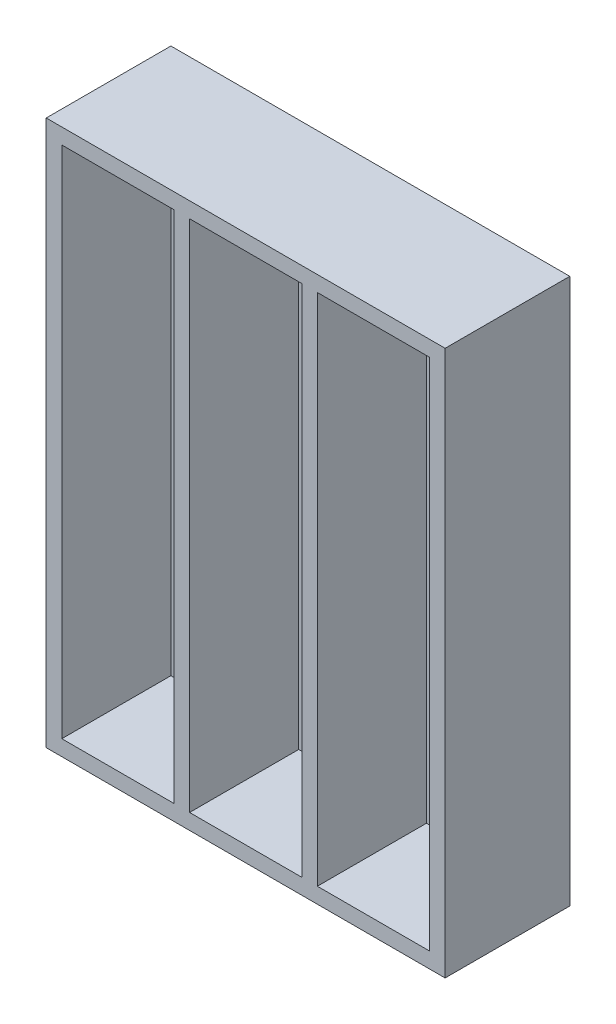
ISO-10303-21;
HEADER;
FILE_DESCRIPTION(('STEP AP214'),'2;1');
FILE_NAME('part.step','',(''),(''),'','','');
FILE_SCHEMA(('AUTOMOTIVE_DESIGN { 1 0 10303 214 1 1 1 1 }'));
ENDSEC;
DATA;
#1=APPLICATION_CONTEXT('core data for automotive mechanical design processes');
#2=APPLICATION_PROTOCOL_DEFINITION('international standard','automotive_design',2000,#1);
#3=PRODUCT_CONTEXT('',#1,'mechanical');
#4=PRODUCT('Part','Part','',(#3));
#5=PRODUCT_RELATED_PRODUCT_CATEGORY('part','',(#4));
#6=PRODUCT_DEFINITION_FORMATION('','',#4);
#7=PRODUCT_DEFINITION_CONTEXT('part definition',#1,'design');
#8=PRODUCT_DEFINITION('design','',#6,#7);
#9=PRODUCT_DEFINITION_SHAPE('','',#8);
#10=(LENGTH_UNIT() NAMED_UNIT(*) SI_UNIT(.MILLI.,.METRE.));
#11=(NAMED_UNIT(*) PLANE_ANGLE_UNIT() SI_UNIT($,.RADIAN.));
#12=(NAMED_UNIT(*) SI_UNIT($,.STERADIAN.) SOLID_ANGLE_UNIT());
#13=UNCERTAINTY_MEASURE_WITH_UNIT(LENGTH_MEASURE(1.E-05),#10,'distance_accuracy_value','');
#14=(GEOMETRIC_REPRESENTATION_CONTEXT(3) GLOBAL_UNCERTAINTY_ASSIGNED_CONTEXT((#13)) GLOBAL_UNIT_ASSIGNED_CONTEXT((#10,
#11,#12)) REPRESENTATION_CONTEXT('',''));
#15=CARTESIAN_POINT('',(0.,0.,0.));
#16=DIRECTION('',(0.,0.,1.));
#17=DIRECTION('',(1.,0.,0.));
#18=AXIS2_PLACEMENT_3D('',#15,#16,#17);
#19=CARTESIAN_POINT('',(10.,10.,80.));
#20=DIRECTION('',(0.,1.,0.));
#21=DIRECTION('',(0.,0.,1.));
#22=AXIS2_PLACEMENT_3D('',#19,#20,#21);
#23=PLANE('',#22);
#24=DIRECTION('',(1.,0.,0.));
#25=VECTOR('',#24,1.);
#26=CARTESIAN_POINT('',(10.,10.,10.));
#27=LINE('',#26,#25);
#28=CARTESIAN_POINT('',(174.,10.,10.));
#29=VERTEX_POINT('',#28);
#30=CARTESIAN_POINT('',(246.,10.,10.));
#31=VERTEX_POINT('',#30);
#32=EDGE_CURVE('E220',#29,#31,#27,.T.);
#33=ORIENTED_EDGE('',*,*,#32,.F.);
#34=DIRECTION('',(0.,0.,-1.));
#35=VECTOR('',#34,1.);
#36=CARTESIAN_POINT('',(174.,10.,80.));
#37=LINE('',#36,#35);
#38=CARTESIAN_POINT('',(174.,10.,80.));
#39=VERTEX_POINT('',#38);
#40=EDGE_CURVE('E183',#39,#29,#37,.T.);
#41=ORIENTED_EDGE('',*,*,#40,.F.);
#42=DIRECTION('',(1.,0.,0.));
#43=VECTOR('',#42,1.);
#44=CARTESIAN_POINT('',(10.,10.,80.));
#45=LINE('',#44,#43);
#46=CARTESIAN_POINT('',(246.,10.,80.));
#47=VERTEX_POINT('',#46);
#48=EDGE_CURVE('E209',#39,#47,#45,.T.);
#49=ORIENTED_EDGE('',*,*,#48,.T.);
#50=DIRECTION('',(0.,0.,-1.));
#51=VECTOR('',#50,1.);
#52=CARTESIAN_POINT('',(246.,10.,80.));
#53=LINE('',#52,#51);
#54=EDGE_CURVE('E234',#47,#31,#53,.T.);
#55=ORIENTED_EDGE('',*,*,#54,.T.);
#56=EDGE_LOOP('',(#33,#41,#49,#55));
#57=FACE_BOUND('',#56,.T.);
#58=ADVANCED_FACE('F33',(#57),#23,.T.);
#59=CARTESIAN_POINT('',(92.,10.,80.));
#60=VERTEX_POINT('',#59);
#61=CARTESIAN_POINT('',(164.,10.,80.));
#62=VERTEX_POINT('',#61);
#63=EDGE_CURVE('E214',#60,#62,#45,.T.);
#64=ORIENTED_EDGE('',*,*,#63,.T.);
#65=DIRECTION('',(0.,0.,-1.));
#66=VECTOR('',#65,1.);
#67=CARTESIAN_POINT('',(164.,10.,80.));
#68=LINE('',#67,#66);
#69=CARTESIAN_POINT('',(164.,10.,10.));
#70=VERTEX_POINT('',#69);
#71=EDGE_CURVE('E169',#62,#70,#68,.T.);
#72=ORIENTED_EDGE('',*,*,#71,.T.);
#73=CARTESIAN_POINT('',(92.,10.,10.));
#74=VERTEX_POINT('',#73);
#75=EDGE_CURVE('E225',#74,#70,#27,.T.);
#76=ORIENTED_EDGE('',*,*,#75,.F.);
#77=DIRECTION('',(0.,0.,-1.));
#78=VECTOR('',#77,1.);
#79=CARTESIAN_POINT('',(92.,10.,80.));
#80=LINE('',#79,#78);
#81=EDGE_CURVE('E201',#60,#74,#80,.T.);
#82=ORIENTED_EDGE('',*,*,#81,.F.);
#83=EDGE_LOOP('',(#64,#72,#76,#82));
#84=FACE_BOUND('',#83,.T.);
#85=ADVANCED_FACE('F292',(#84),#23,.T.);
#86=CARTESIAN_POINT('',(10.,340.,80.));
#87=DIRECTION('',(0.,-1.,0.));
#88=DIRECTION('',(0.,0.,-1.));
#89=AXIS2_PLACEMENT_3D('',#86,#87,#88);
#90=PLANE('',#89);
#91=DIRECTION('',(-1.,0.,0.));
#92=VECTOR('',#91,1.);
#93=CARTESIAN_POINT('',(10.,340.,80.));
#94=LINE('',#93,#92);
#95=CARTESIAN_POINT('',(246.,340.,80.));
#96=VERTEX_POINT('',#95);
#97=CARTESIAN_POINT('',(174.,340.,80.));
#98=VERTEX_POINT('',#97);
#99=EDGE_CURVE('E161',#96,#98,#94,.T.);
#100=ORIENTED_EDGE('',*,*,#99,.T.);
#101=DIRECTION('',(0.,0.,-1.));
#102=VECTOR('',#101,1.);
#103=CARTESIAN_POINT('',(174.,340.,80.));
#104=LINE('',#103,#102);
#105=CARTESIAN_POINT('',(174.,340.,10.));
#106=VERTEX_POINT('',#105);
#107=EDGE_CURVE('E56',#98,#106,#104,.T.);
#108=ORIENTED_EDGE('',*,*,#107,.T.);
#109=DIRECTION('',(-1.,0.,0.));
#110=VECTOR('',#109,1.);
#111=CARTESIAN_POINT('',(10.,340.,10.));
#112=LINE('',#111,#110);
#113=CARTESIAN_POINT('',(246.,340.,10.));
#114=VERTEX_POINT('',#113);
#115=EDGE_CURVE('E210',#114,#106,#112,.T.);
#116=ORIENTED_EDGE('',*,*,#115,.F.);
#117=DIRECTION('',(0.,0.,-1.));
#118=VECTOR('',#117,1.);
#119=CARTESIAN_POINT('',(246.,340.,80.));
#120=LINE('',#119,#118);
#121=EDGE_CURVE('E232',#96,#114,#120,.T.);
#122=ORIENTED_EDGE('',*,*,#121,.F.);
#123=EDGE_LOOP('',(#100,#108,#116,#122));
#124=FACE_BOUND('',#123,.T.);
#125=ADVANCED_FACE('F299',(#124),#90,.T.);
#126=CARTESIAN_POINT('',(164.,340.,10.));
#127=VERTEX_POINT('',#126);
#128=CARTESIAN_POINT('',(92.,340.,10.));
#129=VERTEX_POINT('',#128);
#130=EDGE_CURVE('E167',#127,#129,#112,.T.);
#131=ORIENTED_EDGE('',*,*,#130,.F.);
#132=DIRECTION('',(0.,0.,-1.));
#133=VECTOR('',#132,1.);
#134=CARTESIAN_POINT('',(164.,340.,80.));
#135=LINE('',#134,#133);
#136=CARTESIAN_POINT('',(164.,340.,80.));
#137=VERTEX_POINT('',#136);
#138=EDGE_CURVE('E165',#137,#127,#135,.T.);
#139=ORIENTED_EDGE('',*,*,#138,.F.);
#140=CARTESIAN_POINT('',(92.,340.,80.));
#141=VERTEX_POINT('',#140);
#142=EDGE_CURVE('E148',#137,#141,#94,.T.);
#143=ORIENTED_EDGE('',*,*,#142,.T.);
#144=DIRECTION('',(0.,0.,-1.));
#145=VECTOR('',#144,1.);
#146=CARTESIAN_POINT('',(92.,340.,80.));
#147=LINE('',#146,#145);
#148=EDGE_CURVE('E199',#141,#129,#147,.T.);
#149=ORIENTED_EDGE('',*,*,#148,.T.);
#150=EDGE_LOOP('',(#131,#139,#143,#149));
#151=FACE_BOUND('',#150,.T.);
#152=ADVANCED_FACE('F166',(#151),#90,.T.);
#153=CARTESIAN_POINT('',(0.,0.,10.));
#154=DIRECTION('',(0.,0.,-1.));
#155=DIRECTION('',(-1.,0.,0.));
#156=AXIS2_PLACEMENT_3D('',#153,#154,#155);
#157=PLANE('',#156);
#158=DIRECTION('',(0.,1.,0.));
#159=VECTOR('',#158,1.);
#160=CARTESIAN_POINT('',(174.,10.,10.));
#161=LINE('',#160,#159);
#162=EDGE_CURVE('E178',#29,#106,#161,.T.);
#163=ORIENTED_EDGE('',*,*,#162,.F.);
#164=ORIENTED_EDGE('',*,*,#32,.T.);
#165=DIRECTION('',(0.,1.,0.));
#166=VECTOR('',#165,1.);
#167=CARTESIAN_POINT('',(246.,10.,10.));
#168=LINE('',#167,#166);
#169=EDGE_CURVE('E224',#31,#114,#168,.T.);
#170=ORIENTED_EDGE('',*,*,#169,.T.);
#171=ORIENTED_EDGE('',*,*,#115,.T.);
#172=EDGE_LOOP('',(#163,#164,#170,#171));
#173=FACE_BOUND('',#172,.T.);
#174=ADVANCED_FACE('F314',(#173),#157,.F.);
#175=DIRECTION('',(0.,-1.,0.));
#176=VECTOR('',#175,1.);
#177=CARTESIAN_POINT('',(164.,10.,10.));
#178=LINE('',#177,#176);
#179=EDGE_CURVE('E48',#127,#70,#178,.T.);
#180=ORIENTED_EDGE('',*,*,#179,.F.);
#181=ORIENTED_EDGE('',*,*,#130,.T.);
#182=DIRECTION('',(0.,1.,0.));
#183=VECTOR('',#182,1.);
#184=CARTESIAN_POINT('',(92.,10.,10.));
#185=LINE('',#184,#183);
#186=EDGE_CURVE('E190',#74,#129,#185,.T.);
#187=ORIENTED_EDGE('',*,*,#186,.F.);
#188=ORIENTED_EDGE('',*,*,#75,.T.);
#189=EDGE_LOOP('',(#180,#181,#187,#188));
#190=FACE_BOUND('',#189,.T.);
#191=ADVANCED_FACE('F306',(#190),#157,.F.);
#192=CARTESIAN_POINT('',(10.,10.,80.));
#193=VERTEX_POINT('',#192);
#194=CARTESIAN_POINT('',(82.,10.,80.));
#195=VERTEX_POINT('',#194);
#196=EDGE_CURVE('E211',#193,#195,#45,.T.);
#197=ORIENTED_EDGE('',*,*,#196,.T.);
#198=DIRECTION('',(0.,0.,-1.));
#199=VECTOR('',#198,1.);
#200=CARTESIAN_POINT('',(82.,10.,80.));
#201=LINE('',#200,#199);
#202=CARTESIAN_POINT('',(82.,10.,10.));
#203=VERTEX_POINT('',#202);
#204=EDGE_CURVE('E204',#195,#203,#201,.T.);
#205=ORIENTED_EDGE('',*,*,#204,.T.);
#206=CARTESIAN_POINT('',(10.,10.,10.));
#207=VERTEX_POINT('',#206);
#208=EDGE_CURVE('E221',#207,#203,#27,.T.);
#209=ORIENTED_EDGE('',*,*,#208,.F.);
#210=DIRECTION('',(0.,0.,-1.));
#211=VECTOR('',#210,1.);
#212=CARTESIAN_POINT('',(10.,10.,80.));
#213=LINE('',#212,#211);
#214=EDGE_CURVE('E237',#193,#207,#213,.T.);
#215=ORIENTED_EDGE('',*,*,#214,.F.);
#216=EDGE_LOOP('',(#197,#205,#209,#215));
#217=FACE_BOUND('',#216,.T.);
#218=ADVANCED_FACE('F295',(#217),#23,.T.);
#219=CARTESIAN_POINT('',(82.,340.,10.));
#220=VERTEX_POINT('',#219);
#221=CARTESIAN_POINT('',(10.,340.,10.));
#222=VERTEX_POINT('',#221);
#223=EDGE_CURVE('E228',#220,#222,#112,.T.);
#224=ORIENTED_EDGE('',*,*,#223,.F.);
#225=DIRECTION('',(0.,0.,-1.));
#226=VECTOR('',#225,1.);
#227=CARTESIAN_POINT('',(82.,340.,80.));
#228=LINE('',#227,#226);
#229=CARTESIAN_POINT('',(82.,340.,80.));
#230=VERTEX_POINT('',#229);
#231=EDGE_CURVE('E192',#230,#220,#228,.T.);
#232=ORIENTED_EDGE('',*,*,#231,.F.);
#233=CARTESIAN_POINT('',(10.,340.,80.));
#234=VERTEX_POINT('',#233);
#235=EDGE_CURVE('E162',#230,#234,#94,.T.);
#236=ORIENTED_EDGE('',*,*,#235,.T.);
#237=DIRECTION('',(0.,0.,-1.));
#238=VECTOR('',#237,1.);
#239=CARTESIAN_POINT('',(10.,340.,80.));
#240=LINE('',#239,#238);
#241=EDGE_CURVE('E217',#234,#222,#240,.T.);
#242=ORIENTED_EDGE('',*,*,#241,.T.);
#243=EDGE_LOOP('',(#224,#232,#236,#242));
#244=FACE_BOUND('',#243,.T.);
#245=ADVANCED_FACE('F305',(#244),#90,.T.);
#246=DIRECTION('',(0.,-1.,0.));
#247=VECTOR('',#246,1.);
#248=CARTESIAN_POINT('',(82.,10.,10.));
#249=LINE('',#248,#247);
#250=EDGE_CURVE('E186',#220,#203,#249,.T.);
#251=ORIENTED_EDGE('',*,*,#250,.F.);
#252=ORIENTED_EDGE('',*,*,#223,.T.);
#253=DIRECTION('',(0.,-1.,0.));
#254=VECTOR('',#253,1.);
#255=CARTESIAN_POINT('',(10.,10.,10.));
#256=LINE('',#255,#254);
#257=EDGE_CURVE('E206',#222,#207,#256,.T.);
#258=ORIENTED_EDGE('',*,*,#257,.T.);
#259=ORIENTED_EDGE('',*,*,#208,.T.);
#260=EDGE_LOOP('',(#251,#252,#258,#259));
#261=FACE_BOUND('',#260,.T.);
#262=ADVANCED_FACE('F290',(#261),#157,.F.);
#263=CARTESIAN_POINT('',(0.,0.,10.));
#264=DIRECTION('',(1.,0.,0.));
#265=DIRECTION('',(0.,0.,-1.));
#266=AXIS2_PLACEMENT_3D('',#263,#264,#265);
#267=PLANE('',#266);
#268=DIRECTION('',(0.,-1.,0.));
#269=VECTOR('',#268,1.);
#270=CARTESIAN_POINT('',(0.,0.,0.));
#271=LINE('',#270,#269);
#272=CARTESIAN_POINT('',(0.,350.,0.));
#273=VERTEX_POINT('',#272);
#274=CARTESIAN_POINT('',(0.,0.,0.));
#275=VERTEX_POINT('',#274);
#276=EDGE_CURVE('E252',#273,#275,#271,.T.);
#277=ORIENTED_EDGE('',*,*,#276,.T.);
#278=DIRECTION('',(0.,0.,-1.));
#279=VECTOR('',#278,1.);
#280=CARTESIAN_POINT('',(0.,0.,10.));
#281=LINE('',#280,#279);
#282=CARTESIAN_POINT('',(0.,0.,80.));
#283=VERTEX_POINT('',#282);
#284=EDGE_CURVE('E11',#283,#275,#281,.T.);
#285=ORIENTED_EDGE('',*,*,#284,.F.);
#286=DIRECTION('',(0.,-1.,0.));
#287=VECTOR('',#286,1.);
#288=CARTESIAN_POINT('',(0.,0.,80.));
#289=LINE('',#288,#287);
#290=CARTESIAN_POINT('',(0.,350.,80.));
#291=VERTEX_POINT('',#290);
#292=EDGE_CURVE('E240',#291,#283,#289,.T.);
#293=ORIENTED_EDGE('',*,*,#292,.F.);
#294=DIRECTION('',(0.,0.,-1.));
#295=VECTOR('',#294,1.);
#296=CARTESIAN_POINT('',(0.,350.,10.));
#297=LINE('',#296,#295);
#298=EDGE_CURVE('E261',#291,#273,#297,.T.);
#299=ORIENTED_EDGE('',*,*,#298,.T.);
#300=EDGE_LOOP('',(#277,#285,#293,#299));
#301=FACE_BOUND('',#300,.T.);
#302=ADVANCED_FACE('F35',(#301),#267,.F.);
#303=CARTESIAN_POINT('',(0.,0.,10.));
#304=DIRECTION('',(0.,1.,0.));
#305=DIRECTION('',(0.,0.,1.));
#306=AXIS2_PLACEMENT_3D('',#303,#304,#305);
#307=PLANE('',#306);
#308=DIRECTION('',(1.,0.,0.));
#309=VECTOR('',#308,1.);
#310=CARTESIAN_POINT('',(0.,0.,0.));
#311=LINE('',#310,#309);
#312=CARTESIAN_POINT('',(256.,0.,0.));
#313=VERTEX_POINT('',#312);
#314=EDGE_CURVE('E255',#275,#313,#311,.T.);
#315=ORIENTED_EDGE('',*,*,#314,.T.);
#316=DIRECTION('',(0.,0.,-1.));
#317=VECTOR('',#316,1.);
#318=CARTESIAN_POINT('',(256.,0.,10.));
#319=LINE('',#318,#317);
#320=CARTESIAN_POINT('',(256.,0.,80.));
#321=VERTEX_POINT('',#320);
#322=EDGE_CURVE('E41',#321,#313,#319,.T.);
#323=ORIENTED_EDGE('',*,*,#322,.F.);
#324=DIRECTION('',(1.,0.,0.));
#325=VECTOR('',#324,1.);
#326=CARTESIAN_POINT('',(0.,0.,80.));
#327=LINE('',#326,#325);
#328=EDGE_CURVE('E243',#283,#321,#327,.T.);
#329=ORIENTED_EDGE('',*,*,#328,.F.);
#330=ORIENTED_EDGE('',*,*,#284,.T.);
#331=EDGE_LOOP('',(#315,#323,#329,#330));
#332=FACE_BOUND('',#331,.T.);
#333=ADVANCED_FACE('F283',(#332),#307,.F.);
#334=CARTESIAN_POINT('',(256.,0.,10.));
#335=DIRECTION('',(-1.,0.,0.));
#336=DIRECTION('',(0.,0.,1.));
#337=AXIS2_PLACEMENT_3D('',#334,#335,#336);
#338=PLANE('',#337);
#339=DIRECTION('',(0.,1.,0.));
#340=VECTOR('',#339,1.);
#341=CARTESIAN_POINT('',(256.,0.,0.));
#342=LINE('',#341,#340);
#343=CARTESIAN_POINT('',(256.,350.,0.));
#344=VERTEX_POINT('',#343);
#345=EDGE_CURVE('E257',#313,#344,#342,.T.);
#346=ORIENTED_EDGE('',*,*,#345,.T.);
#347=DIRECTION('',(0.,0.,-1.));
#348=VECTOR('',#347,1.);
#349=CARTESIAN_POINT('',(256.,350.,10.));
#350=LINE('',#349,#348);
#351=CARTESIAN_POINT('',(256.,350.,80.));
#352=VERTEX_POINT('',#351);
#353=EDGE_CURVE('E264',#352,#344,#350,.T.);
#354=ORIENTED_EDGE('',*,*,#353,.F.);
#355=DIRECTION('',(0.,1.,0.));
#356=VECTOR('',#355,1.);
#357=CARTESIAN_POINT('',(256.,0.,80.));
#358=LINE('',#357,#356);
#359=EDGE_CURVE('E246',#321,#352,#358,.T.);
#360=ORIENTED_EDGE('',*,*,#359,.F.);
#361=ORIENTED_EDGE('',*,*,#322,.T.);
#362=EDGE_LOOP('',(#346,#354,#360,#361));
#363=FACE_BOUND('',#362,.T.);
#364=ADVANCED_FACE('F270',(#363),#338,.F.);
#365=CARTESIAN_POINT('',(0.,350.,10.));
#366=DIRECTION('',(0.,-1.,0.));
#367=DIRECTION('',(0.,0.,-1.));
#368=AXIS2_PLACEMENT_3D('',#365,#366,#367);
#369=PLANE('',#368);
#370=DIRECTION('',(-1.,0.,0.));
#371=VECTOR('',#370,1.);
#372=CARTESIAN_POINT('',(0.,350.,0.));
#373=LINE('',#372,#371);
#374=EDGE_CURVE('E259',#344,#273,#373,.T.);
#375=ORIENTED_EDGE('',*,*,#374,.T.);
#376=ORIENTED_EDGE('',*,*,#298,.F.);
#377=DIRECTION('',(-1.,0.,0.));
#378=VECTOR('',#377,1.);
#379=CARTESIAN_POINT('',(0.,350.,80.));
#380=LINE('',#379,#378);
#381=EDGE_CURVE('E249',#352,#291,#380,.T.);
#382=ORIENTED_EDGE('',*,*,#381,.F.);
#383=ORIENTED_EDGE('',*,*,#353,.T.);
#384=EDGE_LOOP('',(#375,#376,#382,#383));
#385=FACE_BOUND('',#384,.T.);
#386=ADVANCED_FACE('F278',(#385),#369,.F.);
#387=CARTESIAN_POINT('',(0.,0.,0.));
#388=DIRECTION('',(0.,0.,-1.));
#389=DIRECTION('',(-1.,0.,0.));
#390=AXIS2_PLACEMENT_3D('',#387,#388,#389);
#391=PLANE('',#390);
#392=ORIENTED_EDGE('',*,*,#276,.F.);
#393=ORIENTED_EDGE('',*,*,#374,.F.);
#394=ORIENTED_EDGE('',*,*,#345,.F.);
#395=ORIENTED_EDGE('',*,*,#314,.F.);
#396=EDGE_LOOP('',(#392,#393,#394,#395));
#397=FACE_BOUND('',#396,.T.);
#398=ADVANCED_FACE('F276',(#397),#391,.T.);
#399=CARTESIAN_POINT('',(0.,0.,80.));
#400=DIRECTION('',(0.,0.,-1.));
#401=DIRECTION('',(-1.,0.,0.));
#402=AXIS2_PLACEMENT_3D('',#399,#400,#401);
#403=PLANE('',#402);
#404=ORIENTED_EDGE('',*,*,#48,.F.);
#405=DIRECTION('',(0.,1.,0.));
#406=VECTOR('',#405,1.);
#407=CARTESIAN_POINT('',(174.,10.,80.));
#408=LINE('',#407,#406);
#409=EDGE_CURVE('E172',#39,#98,#408,.T.);
#410=ORIENTED_EDGE('',*,*,#409,.T.);
#411=ORIENTED_EDGE('',*,*,#99,.F.);
#412=DIRECTION('',(0.,1.,0.));
#413=VECTOR('',#412,1.);
#414=CARTESIAN_POINT('',(246.,10.,80.));
#415=LINE('',#414,#413);
#416=EDGE_CURVE('E213',#47,#96,#415,.T.);
#417=ORIENTED_EDGE('',*,*,#416,.F.);
#418=EDGE_LOOP('',(#404,#410,#411,#417));
#419=FACE_BOUND('',#418,.T.);
#420=ORIENTED_EDGE('',*,*,#63,.F.);
#421=DIRECTION('',(0.,1.,0.));
#422=VECTOR('',#421,1.);
#423=CARTESIAN_POINT('',(92.,10.,80.));
#424=LINE('',#423,#422);
#425=EDGE_CURVE('E157',#60,#141,#424,.T.);
#426=ORIENTED_EDGE('',*,*,#425,.T.);
#427=ORIENTED_EDGE('',*,*,#142,.F.);
#428=DIRECTION('',(0.,-1.,0.));
#429=VECTOR('',#428,1.);
#430=CARTESIAN_POINT('',(164.,10.,80.));
#431=LINE('',#430,#429);
#432=EDGE_CURVE('E154',#137,#62,#431,.T.);
#433=ORIENTED_EDGE('',*,*,#432,.T.);
#434=EDGE_LOOP('',(#420,#426,#427,#433));
#435=FACE_BOUND('',#434,.T.);
#436=ORIENTED_EDGE('',*,*,#292,.T.);
#437=ORIENTED_EDGE('',*,*,#328,.T.);
#438=ORIENTED_EDGE('',*,*,#359,.T.);
#439=ORIENTED_EDGE('',*,*,#381,.T.);
#440=EDGE_LOOP('',(#436,#437,#438,#439));
#441=FACE_BOUND('',#440,.T.);
#442=DIRECTION('',(0.,-1.,0.));
#443=VECTOR('',#442,1.);
#444=CARTESIAN_POINT('',(10.,10.,80.));
#445=LINE('',#444,#443);
#446=EDGE_CURVE('E207',#234,#193,#445,.T.);
#447=ORIENTED_EDGE('',*,*,#446,.F.);
#448=ORIENTED_EDGE('',*,*,#235,.F.);
#449=DIRECTION('',(0.,-1.,0.));
#450=VECTOR('',#449,1.);
#451=CARTESIAN_POINT('',(82.,10.,80.));
#452=LINE('',#451,#450);
#453=EDGE_CURVE('E187',#230,#195,#452,.T.);
#454=ORIENTED_EDGE('',*,*,#453,.T.);
#455=ORIENTED_EDGE('',*,*,#196,.F.);
#456=EDGE_LOOP('',(#447,#448,#454,#455));
#457=FACE_BOUND('',#456,.T.);
#458=ADVANCED_FACE('F151',(#419,#435,#441,#457),#403,.F.);
#459=CARTESIAN_POINT('',(10.,10.,80.));
#460=DIRECTION('',(1.,0.,0.));
#461=DIRECTION('',(0.,0.,-1.));
#462=AXIS2_PLACEMENT_3D('',#459,#460,#461);
#463=PLANE('',#462);
#464=ORIENTED_EDGE('',*,*,#257,.F.);
#465=ORIENTED_EDGE('',*,*,#241,.F.);
#466=ORIENTED_EDGE('',*,*,#446,.T.);
#467=ORIENTED_EDGE('',*,*,#214,.T.);
#468=EDGE_LOOP('',(#464,#465,#466,#467));
#469=FACE_BOUND('',#468,.T.);
#470=ADVANCED_FACE('F354',(#469),#463,.T.);
#471=CARTESIAN_POINT('',(246.,10.,80.));
#472=DIRECTION('',(-1.,0.,0.));
#473=DIRECTION('',(0.,0.,1.));
#474=AXIS2_PLACEMENT_3D('',#471,#472,#473);
#475=PLANE('',#474);
#476=ORIENTED_EDGE('',*,*,#169,.F.);
#477=ORIENTED_EDGE('',*,*,#54,.F.);
#478=ORIENTED_EDGE('',*,*,#416,.T.);
#479=ORIENTED_EDGE('',*,*,#121,.T.);
#480=EDGE_LOOP('',(#476,#477,#478,#479));
#481=FACE_BOUND('',#480,.T.);
#482=ADVANCED_FACE('F338',(#481),#475,.T.);
#483=CARTESIAN_POINT('',(82.,10.,80.));
#484=DIRECTION('',(1.,0.,0.));
#485=DIRECTION('',(0.,0.,-1.));
#486=AXIS2_PLACEMENT_3D('',#483,#484,#485);
#487=PLANE('',#486);
#488=ORIENTED_EDGE('',*,*,#250,.T.);
#489=ORIENTED_EDGE('',*,*,#204,.F.);
#490=ORIENTED_EDGE('',*,*,#453,.F.);
#491=ORIENTED_EDGE('',*,*,#231,.T.);
#492=EDGE_LOOP('',(#488,#489,#490,#491));
#493=FACE_BOUND('',#492,.T.);
#494=ADVANCED_FACE('F323',(#493),#487,.F.);
#495=CARTESIAN_POINT('',(92.,10.,80.));
#496=DIRECTION('',(-1.,0.,0.));
#497=DIRECTION('',(0.,0.,1.));
#498=AXIS2_PLACEMENT_3D('',#495,#496,#497);
#499=PLANE('',#498);
#500=ORIENTED_EDGE('',*,*,#186,.T.);
#501=ORIENTED_EDGE('',*,*,#148,.F.);
#502=ORIENTED_EDGE('',*,*,#425,.F.);
#503=ORIENTED_EDGE('',*,*,#81,.T.);
#504=EDGE_LOOP('',(#500,#501,#502,#503));
#505=FACE_BOUND('',#504,.T.);
#506=ADVANCED_FACE('F330',(#505),#499,.F.);
#507=CARTESIAN_POINT('',(174.,10.,80.));
#508=DIRECTION('',(-1.,0.,0.));
#509=DIRECTION('',(0.,0.,1.));
#510=AXIS2_PLACEMENT_3D('',#507,#508,#509);
#511=PLANE('',#510);
#512=ORIENTED_EDGE('',*,*,#162,.T.);
#513=ORIENTED_EDGE('',*,*,#107,.F.);
#514=ORIENTED_EDGE('',*,*,#409,.F.);
#515=ORIENTED_EDGE('',*,*,#40,.T.);
#516=EDGE_LOOP('',(#512,#513,#514,#515));
#517=FACE_BOUND('',#516,.T.);
#518=ADVANCED_FACE('F342',(#517),#511,.F.);
#519=CARTESIAN_POINT('',(164.,10.,80.));
#520=DIRECTION('',(1.,0.,0.));
#521=DIRECTION('',(0.,0.,-1.));
#522=AXIS2_PLACEMENT_3D('',#519,#520,#521);
#523=PLANE('',#522);
#524=ORIENTED_EDGE('',*,*,#179,.T.);
#525=ORIENTED_EDGE('',*,*,#71,.F.);
#526=ORIENTED_EDGE('',*,*,#432,.F.);
#527=ORIENTED_EDGE('',*,*,#138,.T.);
#528=EDGE_LOOP('',(#524,#525,#526,#527));
#529=FACE_BOUND('',#528,.T.);
#530=ADVANCED_FACE('F171',(#529),#523,.F.);
#531=CLOSED_SHELL('',(#58,#85,#125,#152,#174,#191,#218,#245,#262,#302,#333,#364,#386,#398,#458,
#470,#482,#494,#506,#518,#530));
#532=MANIFOLD_SOLID_BREP('B2',#531);
#533=ADVANCED_BREP_SHAPE_REPRESENTATION('',(#18,#532),#14);
#534=SHAPE_DEFINITION_REPRESENTATION(#9,#533);
ENDSEC;
END-ISO-10303-21;
